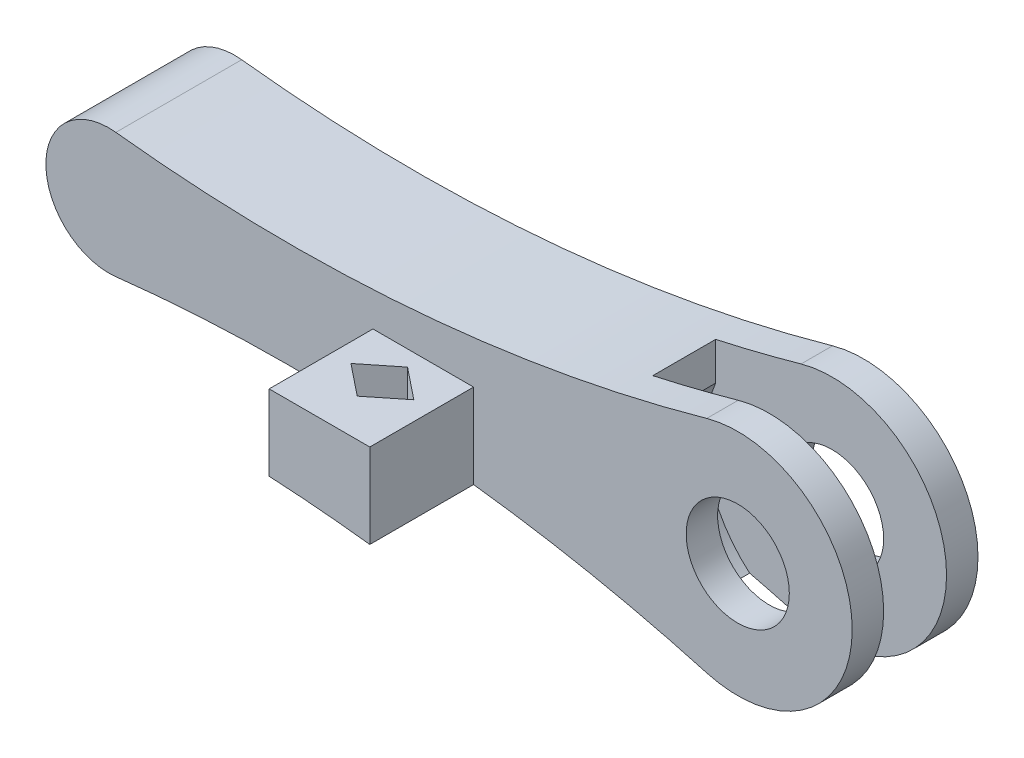
ISO-10303-21;
HEADER;
FILE_DESCRIPTION(('STEP AP214'),'2;1');
FILE_NAME('part.step','',(''),(''),'','','');
FILE_SCHEMA(('AUTOMOTIVE_DESIGN { 1 0 10303 214 1 1 1 1 }'));
ENDSEC;
DATA;
#1=APPLICATION_CONTEXT('core data for automotive mechanical design processes');
#2=APPLICATION_PROTOCOL_DEFINITION('international standard','automotive_design',2000,#1);
#3=PRODUCT_CONTEXT('',#1,'mechanical');
#4=PRODUCT('Part','Part','',(#3));
#5=PRODUCT_RELATED_PRODUCT_CATEGORY('part','',(#4));
#6=PRODUCT_DEFINITION_FORMATION('','',#4);
#7=PRODUCT_DEFINITION_CONTEXT('part definition',#1,'design');
#8=PRODUCT_DEFINITION('design','',#6,#7);
#9=PRODUCT_DEFINITION_SHAPE('','',#8);
#10=(LENGTH_UNIT() NAMED_UNIT(*) SI_UNIT(.MILLI.,.METRE.));
#11=(NAMED_UNIT(*) PLANE_ANGLE_UNIT() SI_UNIT($,.RADIAN.));
#12=(NAMED_UNIT(*) SI_UNIT($,.STERADIAN.) SOLID_ANGLE_UNIT());
#13=UNCERTAINTY_MEASURE_WITH_UNIT(LENGTH_MEASURE(1.E-05),#10,'distance_accuracy_value','');
#14=(GEOMETRIC_REPRESENTATION_CONTEXT(3) GLOBAL_UNCERTAINTY_ASSIGNED_CONTEXT((#13)) GLOBAL_UNIT_ASSIGNED_CONTEXT((#10,
#11,#12)) REPRESENTATION_CONTEXT('',''));
#15=CARTESIAN_POINT('',(0.,0.,0.));
#16=DIRECTION('',(0.,0.,1.));
#17=DIRECTION('',(1.,0.,0.));
#18=AXIS2_PLACEMENT_3D('',#15,#16,#17);
#19=CARTESIAN_POINT('',(0.,0.,5.));
#20=DIRECTION('',(0.,0.,1.));
#21=DIRECTION('',(1.,0.,0.));
#22=AXIS2_PLACEMENT_3D('',#19,#20,#21);
#23=PLANE('',#22);
#24=CARTESIAN_POINT('',(0.,0.,5.));
#25=DIRECTION('',(0.,0.,1.));
#26=DIRECTION('',(1.,0.,0.));
#27=AXIS2_PLACEMENT_3D('',#24,#25,#26);
#28=CIRCLE('',#27,4.1);
#29=CARTESIAN_POINT('',(4.1,0.,5.));
#30=VERTEX_POINT('',#29);
#31=EDGE_CURVE('E272',#30,#30,#28,.T.);
#32=ORIENTED_EDGE('',*,*,#31,.F.);
#33=EDGE_LOOP('',(#32));
#34=FACE_BOUND('',#33,.T.);
#35=CARTESIAN_POINT('',(-35.6231,-126.686837305183,5.));
#36=DIRECTION('',(0.,0.,1.));
#37=DIRECTION('',(1.,0.,0.));
#38=AXIS2_PLACEMENT_3D('',#35,#36,#37);
#39=CIRCLE('',#38,122.5);
#40=CARTESIAN_POINT('',(-49.4362,-4.96811126686994,5.));
#41=VERTEX_POINT('',#40);
#42=CARTESIAN_POINT('',(-29.,-4.36601100651091,5.));
#43=VERTEX_POINT('',#42);
#44=EDGE_CURVE('E270',#41,#43,#39,.F.);
#45=ORIENTED_EDGE('',*,*,#44,.T.);
#46=DIRECTION('',(0.,1.,0.));
#47=VECTOR('',#46,1.);
#48=CARTESIAN_POINT('',(-29.,0.,5.));
#49=LINE('',#48,#47);
#50=CARTESIAN_POINT('',(-29.,1.65114992490566,5.));
#51=VERTEX_POINT('',#50);
#52=EDGE_CURVE('E217',#43,#51,#49,.T.);
#53=ORIENTED_EDGE('',*,*,#52,.T.);
#54=DIRECTION('',(1.,0.,0.));
#55=VECTOR('',#54,1.);
#56=CARTESIAN_POINT('',(0.,1.65114992490567,5.));
#57=LINE('',#56,#55);
#58=CARTESIAN_POINT('',(-21.,1.65114992490562,5.));
#59=VERTEX_POINT('',#58);
#60=EDGE_CURVE('E228',#51,#59,#57,.T.);
#61=ORIENTED_EDGE('',*,*,#60,.T.);
#62=DIRECTION('',(0.,1.,0.));
#63=VECTOR('',#62,1.);
#64=CARTESIAN_POINT('',(-21.,0.,5.));
#65=LINE('',#64,#63);
#66=CARTESIAN_POINT('',(-21.,-5.06276507279181,5.));
#67=VERTEX_POINT('',#66);
#68=EDGE_CURVE('E212',#67,#59,#65,.T.);
#69=ORIENTED_EDGE('',*,*,#68,.F.);
#70=CARTESIAN_POINT('',(-2.46329946808511,-8.76026002642226,5.));
#71=VERTEX_POINT('',#70);
#72=EDGE_CURVE('E269',#67,#71,#39,.F.);
#73=ORIENTED_EDGE('',*,*,#72,.T.);
#74=CARTESIAN_POINT('',(0.,0.,5.));
#75=DIRECTION('',(0.,0.,1.));
#76=DIRECTION('',(1.,0.,0.));
#77=AXIS2_PLACEMENT_3D('',#74,#75,#76);
#78=CIRCLE('',#77,9.1);
#79=CARTESIAN_POINT('',(-2.46329946808511,8.76026002642226,5.));
#80=VERTEX_POINT('',#79);
#81=EDGE_CURVE('E261',#71,#80,#78,.T.);
#82=ORIENTED_EDGE('',*,*,#81,.T.);
#83=CARTESIAN_POINT('',(-35.6231,126.686837305183,5.));
#84=DIRECTION('',(0.,0.,1.));
#85=DIRECTION('',(1.,0.,0.));
#86=AXIS2_PLACEMENT_3D('',#83,#84,#85);
#87=CIRCLE('',#86,122.5);
#88=CARTESIAN_POINT('',(-49.4362,4.96811126686994,5.));
#89=VERTEX_POINT('',#88);
#90=EDGE_CURVE('E263',#89,#80,#87,.T.);
#91=ORIENTED_EDGE('',*,*,#90,.F.);
#92=CARTESIAN_POINT('',(-50.,0.,5.));
#93=DIRECTION('',(0.,0.,1.));
#94=DIRECTION('',(1.,0.,0.));
#95=AXIS2_PLACEMENT_3D('',#92,#93,#94);
#96=CIRCLE('',#95,5.);
#97=EDGE_CURVE('E267',#89,#41,#96,.T.);
#98=ORIENTED_EDGE('',*,*,#97,.T.);
#99=EDGE_LOOP('',(#45,#53,#61,#69,#73,#82,#91,#98));
#100=FACE_BOUND('',#99,.T.);
#101=ADVANCED_FACE('F49',(#34,#100),#23,.T.);
#102=CARTESIAN_POINT('',(0.,0.,5.));
#103=DIRECTION('',(0.,0.,-1.));
#104=DIRECTION('',(-1.,0.,0.));
#105=AXIS2_PLACEMENT_3D('',#102,#103,#104);
#106=CYLINDRICAL_SURFACE('',#105,9.1);
#107=CARTESIAN_POINT('',(0.,0.,-2.5));
#108=DIRECTION('',(0.,0.,1.));
#109=DIRECTION('',(1.,0.,0.));
#110=AXIS2_PLACEMENT_3D('',#107,#108,#109);
#111=CIRCLE('',#110,9.1);
#112=CARTESIAN_POINT('',(-2.46329946808511,-8.76026002642226,-2.5));
#113=VERTEX_POINT('',#112);
#114=CARTESIAN_POINT('',(-2.46329946808511,8.76026002642225,-2.5));
#115=VERTEX_POINT('',#114);
#116=EDGE_CURVE('E257',#113,#115,#111,.T.);
#117=ORIENTED_EDGE('',*,*,#116,.F.);
#118=DIRECTION('',(0.,0.,-1.));
#119=VECTOR('',#118,1.);
#120=CARTESIAN_POINT('',(-2.46329946808511,-8.76026002642226,5.));
#121=LINE('',#120,#119);
#122=CARTESIAN_POINT('',(-2.46329946808511,-8.76026002642226,-5.));
#123=VERTEX_POINT('',#122);
#124=EDGE_CURVE('E275',#113,#123,#121,.T.);
#125=ORIENTED_EDGE('',*,*,#124,.T.);
#126=CARTESIAN_POINT('',(0.,0.,-5.));
#127=DIRECTION('',(0.,0.,1.));
#128=DIRECTION('',(1.,0.,0.));
#129=AXIS2_PLACEMENT_3D('',#126,#127,#128);
#130=CIRCLE('',#129,9.1);
#131=CARTESIAN_POINT('',(-2.46329946808511,8.76026002642226,-5.));
#132=VERTEX_POINT('',#131);
#133=EDGE_CURVE('E260',#123,#132,#130,.T.);
#134=ORIENTED_EDGE('',*,*,#133,.T.);
#135=DIRECTION('',(0.,0.,-1.));
#136=VECTOR('',#135,1.);
#137=CARTESIAN_POINT('',(-2.46329946808511,8.76026002642226,5.));
#138=LINE('',#137,#136);
#139=EDGE_CURVE('E296',#115,#132,#138,.T.);
#140=ORIENTED_EDGE('',*,*,#139,.F.);
#141=EDGE_LOOP('',(#117,#125,#134,#140));
#142=FACE_BOUND('',#141,.T.);
#143=ADVANCED_FACE('F324',(#142),#106,.T.);
#144=CARTESIAN_POINT('',(-35.6231,126.686837305183,5.));
#145=DIRECTION('',(0.,0.,-1.));
#146=DIRECTION('',(-1.,0.,0.));
#147=AXIS2_PLACEMENT_3D('',#144,#145,#146);
#148=CYLINDRICAL_SURFACE('',#147,122.5);
#149=CARTESIAN_POINT('',(-35.6231,126.686837305183,2.5));
#150=DIRECTION('',(0.,0.,1.));
#151=DIRECTION('',(1.,0.,0.));
#152=AXIS2_PLACEMENT_3D('',#149,#150,#151);
#153=CIRCLE('',#152,122.5);
#154=CARTESIAN_POINT('',(-9.25575672154349,7.05819019908241,2.5));
#155=VERTEX_POINT('',#154);
#156=CARTESIAN_POINT('',(-2.46329946808511,8.76026002642225,2.5));
#157=VERTEX_POINT('',#156);
#158=EDGE_CURVE('E65',#155,#157,#153,.T.);
#159=ORIENTED_EDGE('',*,*,#158,.F.);
#160=DIRECTION('',(0.,0.,-1.));
#161=VECTOR('',#160,1.);
#162=CARTESIAN_POINT('',(-9.25575672154349,7.0581901990824,5.));
#163=LINE('',#162,#161);
#164=CARTESIAN_POINT('',(-9.25575672154349,7.05819019908242,-2.5));
#165=VERTEX_POINT('',#164);
#166=EDGE_CURVE('E309',#155,#165,#163,.T.);
#167=ORIENTED_EDGE('',*,*,#166,.T.);
#168=CARTESIAN_POINT('',(-35.6231,126.686837305183,-2.5));
#169=DIRECTION('',(0.,0.,1.));
#170=DIRECTION('',(1.,0.,0.));
#171=AXIS2_PLACEMENT_3D('',#168,#169,#170);
#172=CIRCLE('',#171,122.5);
#173=EDGE_CURVE('E72',#165,#115,#172,.T.);
#174=ORIENTED_EDGE('',*,*,#173,.T.);
#175=ORIENTED_EDGE('',*,*,#139,.T.);
#176=CARTESIAN_POINT('',(-35.6231,126.686837305183,-5.));
#177=DIRECTION('',(0.,0.,1.));
#178=DIRECTION('',(1.,0.,0.));
#179=AXIS2_PLACEMENT_3D('',#176,#177,#178);
#180=CIRCLE('',#179,122.5);
#181=CARTESIAN_POINT('',(-49.4362,4.96811126686994,-5.));
#182=VERTEX_POINT('',#181);
#183=EDGE_CURVE('E278',#182,#132,#180,.T.);
#184=ORIENTED_EDGE('',*,*,#183,.F.);
#185=DIRECTION('',(0.,0.,-1.));
#186=VECTOR('',#185,1.);
#187=CARTESIAN_POINT('',(-49.4362,4.96811126686994,5.));
#188=LINE('',#187,#186);
#189=EDGE_CURVE('E294',#89,#182,#188,.T.);
#190=ORIENTED_EDGE('',*,*,#189,.F.);
#191=ORIENTED_EDGE('',*,*,#90,.T.);
#192=EDGE_CURVE('E297',#80,#157,#138,.T.);
#193=ORIENTED_EDGE('',*,*,#192,.T.);
#194=EDGE_LOOP('',(#159,#167,#174,#175,#184,#190,#191,#193));
#195=FACE_BOUND('',#194,.T.);
#196=ADVANCED_FACE('F319',(#195),#148,.F.);
#197=CARTESIAN_POINT('',(-35.6231,-126.686837305183,5.));
#198=DIRECTION('',(0.,0.,-1.));
#199=DIRECTION('',(-1.,0.,0.));
#200=AXIS2_PLACEMENT_3D('',#197,#198,#199);
#201=CYLINDRICAL_SURFACE('',#200,122.5);
#202=CARTESIAN_POINT('',(-35.6231,-126.686837305183,18.7487672564993));
#203=DIRECTION('',(0.624707922465223,0.,0.780858509340319));
#204=DIRECTION('',(0.780858509340319,0.,-0.624707922465223));
#205=AXIS2_PLACEMENT_3D('',#202,#203,#204);
#206=ELLIPSE('',#205,156.878613135035,122.5);
#207=CARTESIAN_POINT('',(-25.,-4.64831983471422,10.25));
#208=VERTEX_POINT('',#207);
#209=CARTESIAN_POINT('',(-22.5000844994605,-4.8917780286569,8.25));
#210=VERTEX_POINT('',#209);
#211=EDGE_CURVE('E206',#208,#210,#206,.F.);
#212=ORIENTED_EDGE('',*,*,#211,.T.);
#213=CARTESIAN_POINT('',(-35.6231,-126.686837305183,-2.24876725649929));
#214=DIRECTION('',(0.624707922465224,0.,-0.780858509340318));
#215=DIRECTION('',(-0.780858509340318,0.,-0.624707922465224));
#216=AXIS2_PLACEMENT_3D('',#213,#214,#215);
#217=ELLIPSE('',#216,156.878613135035,122.5);
#218=CARTESIAN_POINT('',(-25.,-4.64831983471425,6.25));
#219=VERTEX_POINT('',#218);
#220=EDGE_CURVE('E209',#210,#219,#217,.F.);
#221=ORIENTED_EDGE('',*,*,#220,.T.);
#222=CARTESIAN_POINT('',(-35.6231,-126.686837305183,14.7487672564993));
#223=DIRECTION('',(-0.624707922465224,0.,-0.780858509340318));
#224=DIRECTION('',(0.780858509340318,0.,-0.624707922465224));
#225=AXIS2_PLACEMENT_3D('',#222,#223,#224);
#226=ELLIPSE('',#225,156.878613135035,122.5);
#227=CARTESIAN_POINT('',(-27.4999155005395,-4.45646516475453,8.25));
#228=VERTEX_POINT('',#227);
#229=EDGE_CURVE('E201',#219,#228,#226,.F.);
#230=ORIENTED_EDGE('',*,*,#229,.T.);
#231=CARTESIAN_POINT('',(-35.6231,-126.686837305183,1.75123274350069));
#232=DIRECTION('',(-0.624707922465225,0.,0.780858509340317));
#233=DIRECTION('',(-0.780858509340317,0.,-0.624707922465225));
#234=AXIS2_PLACEMENT_3D('',#231,#232,#233);
#235=ELLIPSE('',#234,156.878613135035,122.5);
#236=EDGE_CURVE('E176',#228,#208,#235,.F.);
#237=ORIENTED_EDGE('',*,*,#236,.T.);
#238=EDGE_LOOP('',(#212,#221,#230,#237));
#239=FACE_BOUND('',#238,.T.);
#240=CARTESIAN_POINT('',(-35.6231,-126.686837305183,-2.5));
#241=DIRECTION('',(0.,0.,1.));
#242=DIRECTION('',(1.,0.,0.));
#243=AXIS2_PLACEMENT_3D('',#240,#241,#242);
#244=CIRCLE('',#243,122.5);
#245=CARTESIAN_POINT('',(-6.55217685229215,-7.68628509075008,-2.5));
#246=VERTEX_POINT('',#245);
#247=EDGE_CURVE('E255',#246,#113,#244,.F.);
#248=ORIENTED_EDGE('',*,*,#247,.F.);
#249=DIRECTION('',(0.,0.,1.));
#250=VECTOR('',#249,1.);
#251=CARTESIAN_POINT('',(-6.55217685229204,-7.68628509075018,0.));
#252=LINE('',#251,#250);
#253=CARTESIAN_POINT('',(-6.55217685229215,-7.68628509075008,2.5));
#254=VERTEX_POINT('',#253);
#255=EDGE_CURVE('E299',#246,#254,#252,.T.);
#256=ORIENTED_EDGE('',*,*,#255,.T.);
#257=CARTESIAN_POINT('',(-35.6231,-126.686837305183,2.5));
#258=DIRECTION('',(0.,0.,1.));
#259=DIRECTION('',(1.,0.,0.));
#260=AXIS2_PLACEMENT_3D('',#257,#258,#259);
#261=CIRCLE('',#260,122.5);
#262=CARTESIAN_POINT('',(-2.46329946808511,-8.76026002642226,2.5));
#263=VERTEX_POINT('',#262);
#264=EDGE_CURVE('E247',#254,#263,#261,.F.);
#265=ORIENTED_EDGE('',*,*,#264,.T.);
#266=EDGE_CURVE('E288',#71,#263,#121,.T.);
#267=ORIENTED_EDGE('',*,*,#266,.F.);
#268=ORIENTED_EDGE('',*,*,#72,.F.);
#269=DIRECTION('',(0.,0.,-1.));
#270=VECTOR('',#269,1.);
#271=CARTESIAN_POINT('',(-21.,-5.06276507279181,13.25));
#272=LINE('',#271,#270);
#273=CARTESIAN_POINT('',(-21.,-5.06276507279181,13.25));
#274=VERTEX_POINT('',#273);
#275=EDGE_CURVE('E239',#274,#67,#272,.T.);
#276=ORIENTED_EDGE('',*,*,#275,.F.);
#277=CARTESIAN_POINT('',(-35.6231,-126.686837305183,13.25));
#278=DIRECTION('',(0.,0.,1.));
#279=DIRECTION('',(1.,0.,0.));
#280=AXIS2_PLACEMENT_3D('',#277,#278,#279);
#281=CIRCLE('',#280,122.5);
#282=CARTESIAN_POINT('',(-29.,-4.3660110065109,13.25));
#283=VERTEX_POINT('',#282);
#284=EDGE_CURVE('E213',#283,#274,#281,.F.);
#285=ORIENTED_EDGE('',*,*,#284,.F.);
#286=DIRECTION('',(0.,0.,-1.));
#287=VECTOR('',#286,1.);
#288=CARTESIAN_POINT('',(-29.,-4.3660110065109,13.25));
#289=LINE('',#288,#287);
#290=EDGE_CURVE('E225',#283,#43,#289,.T.);
#291=ORIENTED_EDGE('',*,*,#290,.T.);
#292=ORIENTED_EDGE('',*,*,#44,.F.);
#293=DIRECTION('',(0.,0.,-1.));
#294=VECTOR('',#293,1.);
#295=CARTESIAN_POINT('',(-49.4362,-4.96811126686994,5.));
#296=LINE('',#295,#294);
#297=CARTESIAN_POINT('',(-49.4362,-4.96811126686994,-5.));
#298=VERTEX_POINT('',#297);
#299=EDGE_CURVE('E291',#41,#298,#296,.T.);
#300=ORIENTED_EDGE('',*,*,#299,.T.);
#301=CARTESIAN_POINT('',(-35.6231,-126.686837305183,-5.));
#302=DIRECTION('',(0.,0.,1.));
#303=DIRECTION('',(1.,0.,0.));
#304=AXIS2_PLACEMENT_3D('',#301,#302,#303);
#305=CIRCLE('',#304,122.5);
#306=EDGE_CURVE('E283',#298,#123,#305,.F.);
#307=ORIENTED_EDGE('',*,*,#306,.T.);
#308=ORIENTED_EDGE('',*,*,#124,.F.);
#309=EDGE_LOOP('',(#248,#256,#265,#267,#268,#276,#285,#291,#292,#300,#307,#308));
#310=FACE_BOUND('',#309,.T.);
#311=ADVANCED_FACE('F347',(#239,#310),#201,.F.);
#312=CARTESIAN_POINT('',(0.,0.,5.));
#313=DIRECTION('',(0.,0.,-1.));
#314=DIRECTION('',(-1.,0.,0.));
#315=AXIS2_PLACEMENT_3D('',#312,#313,#314);
#316=CYLINDRICAL_SURFACE('',#315,4.1);
#317=CARTESIAN_POINT('',(0.,0.,-5.));
#318=DIRECTION('',(0.,0.,1.));
#319=DIRECTION('',(1.,0.,0.));
#320=AXIS2_PLACEMENT_3D('',#317,#318,#319);
#321=CIRCLE('',#320,4.1);
#322=CARTESIAN_POINT('',(4.1,0.,-5.));
#323=VERTEX_POINT('',#322);
#324=EDGE_CURVE('E264',#323,#323,#321,.T.);
#325=ORIENTED_EDGE('',*,*,#324,.F.);
#326=EDGE_LOOP('',(#325));
#327=FACE_BOUND('',#326,.T.);
#328=CARTESIAN_POINT('',(0.,0.,-2.5));
#329=DIRECTION('',(0.,0.,1.));
#330=DIRECTION('',(1.,0.,0.));
#331=AXIS2_PLACEMENT_3D('',#328,#329,#330);
#332=CIRCLE('',#331,4.1);
#333=CARTESIAN_POINT('',(4.1,0.,-2.5));
#334=VERTEX_POINT('',#333);
#335=EDGE_CURVE('E254',#334,#334,#332,.T.);
#336=ORIENTED_EDGE('',*,*,#335,.T.);
#337=EDGE_LOOP('',(#336));
#338=FACE_BOUND('',#337,.T.);
#339=ADVANCED_FACE('F380',(#327,#338),#316,.F.);
#340=ORIENTED_EDGE('',*,*,#266,.T.);
#341=CARTESIAN_POINT('',(0.,0.,2.5));
#342=DIRECTION('',(0.,0.,1.));
#343=DIRECTION('',(1.,0.,0.));
#344=AXIS2_PLACEMENT_3D('',#341,#342,#343);
#345=CIRCLE('',#344,9.1);
#346=EDGE_CURVE('E250',#263,#157,#345,.T.);
#347=ORIENTED_EDGE('',*,*,#346,.T.);
#348=ORIENTED_EDGE('',*,*,#192,.F.);
#349=ORIENTED_EDGE('',*,*,#81,.F.);
#350=EDGE_LOOP('',(#340,#347,#348,#349));
#351=FACE_BOUND('',#350,.T.);
#352=ADVANCED_FACE('F344',(#351),#106,.T.);
#353=CARTESIAN_POINT('',(-50.,0.,5.));
#354=DIRECTION('',(0.,0.,-1.));
#355=DIRECTION('',(-1.,0.,0.));
#356=AXIS2_PLACEMENT_3D('',#353,#354,#355);
#357=CYLINDRICAL_SURFACE('',#356,5.);
#358=CARTESIAN_POINT('',(-50.,0.,-5.));
#359=DIRECTION('',(0.,0.,1.));
#360=DIRECTION('',(1.,0.,0.));
#361=AXIS2_PLACEMENT_3D('',#358,#359,#360);
#362=CIRCLE('',#361,5.);
#363=EDGE_CURVE('E281',#182,#298,#362,.T.);
#364=ORIENTED_EDGE('',*,*,#363,.T.);
#365=ORIENTED_EDGE('',*,*,#299,.F.);
#366=ORIENTED_EDGE('',*,*,#97,.F.);
#367=ORIENTED_EDGE('',*,*,#189,.T.);
#368=EDGE_LOOP('',(#364,#365,#366,#367));
#369=FACE_BOUND('',#368,.T.);
#370=ADVANCED_FACE('F336',(#369),#357,.T.);
#371=CARTESIAN_POINT('',(0.,0.,2.5));
#372=DIRECTION('',(0.,0.,1.));
#373=DIRECTION('',(1.,0.,0.));
#374=AXIS2_PLACEMENT_3D('',#371,#372,#373);
#375=CIRCLE('',#374,4.1);
#376=CARTESIAN_POINT('',(4.1,0.,2.5));
#377=VERTEX_POINT('',#376);
#378=EDGE_CURVE('E245',#377,#377,#375,.T.);
#379=ORIENTED_EDGE('',*,*,#378,.F.);
#380=EDGE_LOOP('',(#379));
#381=FACE_BOUND('',#380,.T.);
#382=ORIENTED_EDGE('',*,*,#31,.T.);
#383=EDGE_LOOP('',(#382));
#384=FACE_BOUND('',#383,.T.);
#385=ADVANCED_FACE('F377',(#381,#384),#316,.F.);
#386=CARTESIAN_POINT('',(0.,0.,-5.));
#387=DIRECTION('',(0.,0.,1.));
#388=DIRECTION('',(1.,0.,0.));
#389=AXIS2_PLACEMENT_3D('',#386,#387,#388);
#390=PLANE('',#389);
#391=ORIENTED_EDGE('',*,*,#133,.F.);
#392=ORIENTED_EDGE('',*,*,#306,.F.);
#393=ORIENTED_EDGE('',*,*,#363,.F.);
#394=ORIENTED_EDGE('',*,*,#183,.T.);
#395=EDGE_LOOP('',(#391,#392,#393,#394));
#396=FACE_BOUND('',#395,.T.);
#397=ORIENTED_EDGE('',*,*,#324,.T.);
#398=EDGE_LOOP('',(#397));
#399=FACE_BOUND('',#398,.T.);
#400=ADVANCED_FACE('F330',(#396,#399),#390,.F.);
#401=CARTESIAN_POINT('',(0.,0.,-2.5));
#402=DIRECTION('',(0.,0.,1.));
#403=DIRECTION('',(1.,0.,0.));
#404=AXIS2_PLACEMENT_3D('',#401,#402,#403);
#405=CYLINDRICAL_SURFACE('',#404,10.1);
#406=CARTESIAN_POINT('',(0.,0.,-2.5));
#407=DIRECTION('',(0.,0.,1.));
#408=DIRECTION('',(1.,0.,0.));
#409=AXIS2_PLACEMENT_3D('',#406,#407,#408);
#410=CIRCLE('',#409,10.1);
#411=CARTESIAN_POINT('',(-9.25381197382283,4.04684617364353,-2.5));
#412=VERTEX_POINT('',#411);
#413=EDGE_CURVE('E243',#412,#246,#410,.T.);
#414=ORIENTED_EDGE('',*,*,#413,.F.);
#415=DIRECTION('',(0.,0.,1.));
#416=VECTOR('',#415,1.);
#417=CARTESIAN_POINT('',(-9.25381197382283,4.04684617364353,-2.5));
#418=LINE('',#417,#416);
#419=CARTESIAN_POINT('',(-9.25381197382283,4.04684617364353,2.5));
#420=VERTEX_POINT('',#419);
#421=EDGE_CURVE('E306',#412,#420,#418,.T.);
#422=ORIENTED_EDGE('',*,*,#421,.T.);
#423=CARTESIAN_POINT('',(0.,0.,2.5));
#424=DIRECTION('',(0.,0.,1.));
#425=DIRECTION('',(1.,0.,0.));
#426=AXIS2_PLACEMENT_3D('',#423,#424,#425);
#427=CIRCLE('',#426,10.1);
#428=EDGE_CURVE('E242',#420,#254,#427,.T.);
#429=ORIENTED_EDGE('',*,*,#428,.T.);
#430=ORIENTED_EDGE('',*,*,#255,.F.);
#431=EDGE_LOOP('',(#414,#422,#429,#430));
#432=FACE_BOUND('',#431,.T.);
#433=ADVANCED_FACE('F351',(#432),#405,.F.);
#434=CARTESIAN_POINT('',(0.,0.,-2.5));
#435=DIRECTION('',(0.,0.,1.));
#436=DIRECTION('',(1.,0.,0.));
#437=AXIS2_PLACEMENT_3D('',#434,#435,#436);
#438=PLANE('',#437);
#439=ORIENTED_EDGE('',*,*,#335,.F.);
#440=EDGE_LOOP('',(#439));
#441=FACE_BOUND('',#440,.T.);
#442=ORIENTED_EDGE('',*,*,#173,.F.);
#443=DIRECTION('',(-0.000645807087695693,0.999999791466581,0.));
#444=VECTOR('',#443,1.);
#445=CARTESIAN_POINT('',(-9.25381197382283,4.04684617364353,-2.5));
#446=LINE('',#445,#444);
#447=EDGE_CURVE('E11',#165,#412,#446,.F.);
#448=ORIENTED_EDGE('',*,*,#447,.T.);
#449=ORIENTED_EDGE('',*,*,#413,.T.);
#450=ORIENTED_EDGE('',*,*,#247,.T.);
#451=ORIENTED_EDGE('',*,*,#116,.T.);
#452=EDGE_LOOP('',(#442,#448,#449,#450,#451));
#453=FACE_BOUND('',#452,.T.);
#454=ADVANCED_FACE('F352',(#441,#453),#438,.T.);
#455=CARTESIAN_POINT('',(0.,0.,2.5));
#456=DIRECTION('',(0.,0.,1.));
#457=DIRECTION('',(1.,0.,0.));
#458=AXIS2_PLACEMENT_3D('',#455,#456,#457);
#459=PLANE('',#458);
#460=ORIENTED_EDGE('',*,*,#158,.T.);
#461=ORIENTED_EDGE('',*,*,#346,.F.);
#462=ORIENTED_EDGE('',*,*,#264,.F.);
#463=ORIENTED_EDGE('',*,*,#428,.F.);
#464=DIRECTION('',(0.000645807087695693,-0.999999791466581,0.));
#465=VECTOR('',#464,1.);
#466=CARTESIAN_POINT('',(-9.25119463296838,-0.00597448830950381,2.5));
#467=LINE('',#466,#465);
#468=EDGE_CURVE('E58',#420,#155,#467,.F.);
#469=ORIENTED_EDGE('',*,*,#468,.T.);
#470=EDGE_LOOP('',(#460,#461,#462,#463,#469));
#471=FACE_BOUND('',#470,.T.);
#472=ORIENTED_EDGE('',*,*,#378,.T.);
#473=EDGE_LOOP('',(#472));
#474=FACE_BOUND('',#473,.T.);
#475=ADVANCED_FACE('F313',(#471,#474),#459,.F.);
#476=CARTESIAN_POINT('',(-21.,0.,13.25));
#477=DIRECTION('',(-1.,0.,0.));
#478=DIRECTION('',(0.,0.,1.));
#479=AXIS2_PLACEMENT_3D('',#476,#477,#478);
#480=PLANE('',#479);
#481=ORIENTED_EDGE('',*,*,#68,.T.);
#482=DIRECTION('',(0.,0.,-1.));
#483=VECTOR('',#482,1.);
#484=CARTESIAN_POINT('',(-21.,1.65114992490562,13.25));
#485=LINE('',#484,#483);
#486=CARTESIAN_POINT('',(-21.,1.65114992490562,13.25));
#487=VERTEX_POINT('',#486);
#488=EDGE_CURVE('E236',#487,#59,#485,.T.);
#489=ORIENTED_EDGE('',*,*,#488,.F.);
#490=DIRECTION('',(0.,1.,0.));
#491=VECTOR('',#490,1.);
#492=CARTESIAN_POINT('',(-21.,0.,13.25));
#493=LINE('',#492,#491);
#494=EDGE_CURVE('E216',#274,#487,#493,.T.);
#495=ORIENTED_EDGE('',*,*,#494,.F.);
#496=ORIENTED_EDGE('',*,*,#275,.T.);
#497=EDGE_LOOP('',(#481,#489,#495,#496));
#498=FACE_BOUND('',#497,.T.);
#499=ADVANCED_FACE('F360',(#498),#480,.F.);
#500=CARTESIAN_POINT('',(0.,1.65114992490567,13.25));
#501=DIRECTION('',(0.,1.,0.));
#502=DIRECTION('',(-1.,0.,0.));
#503=AXIS2_PLACEMENT_3D('',#500,#501,#502);
#504=PLANE('',#503);
#505=DIRECTION('',(-0.780858509340318,0.,-0.624707922465224));
#506=VECTOR('',#505,1.);
#507=CARTESIAN_POINT('',(-22.5000844994605,1.65114992490567,8.25));
#508=LINE('',#507,#506);
#509=CARTESIAN_POINT('',(-22.5000844994605,1.65114992490567,8.25));
#510=VERTEX_POINT('',#509);
#511=CARTESIAN_POINT('',(-25.,1.65114992490567,6.25));
#512=VERTEX_POINT('',#511);
#513=EDGE_CURVE('E189',#510,#512,#508,.T.);
#514=ORIENTED_EDGE('',*,*,#513,.F.);
#515=DIRECTION('',(0.780858509340319,0.,-0.624707922465223));
#516=VECTOR('',#515,1.);
#517=CARTESIAN_POINT('',(-22.5000844994605,1.65114992490567,8.25));
#518=LINE('',#517,#516);
#519=CARTESIAN_POINT('',(-25.,1.65114992490567,10.25));
#520=VERTEX_POINT('',#519);
#521=EDGE_CURVE('E194',#520,#510,#518,.T.);
#522=ORIENTED_EDGE('',*,*,#521,.F.);
#523=DIRECTION('',(0.780858509340317,0.,0.624707922465225));
#524=VECTOR('',#523,1.);
#525=CARTESIAN_POINT('',(-25.,1.65114992490567,10.25));
#526=LINE('',#525,#524);
#527=CARTESIAN_POINT('',(-27.4999155005395,1.65114992490567,8.25));
#528=VERTEX_POINT('',#527);
#529=EDGE_CURVE('E173',#528,#520,#526,.T.);
#530=ORIENTED_EDGE('',*,*,#529,.F.);
#531=DIRECTION('',(-0.780858509340318,0.,0.624707922465224));
#532=VECTOR('',#531,1.);
#533=CARTESIAN_POINT('',(-25.,1.65114992490567,6.25));
#534=LINE('',#533,#532);
#535=EDGE_CURVE('E184',#512,#528,#534,.T.);
#536=ORIENTED_EDGE('',*,*,#535,.F.);
#537=EDGE_LOOP('',(#514,#522,#530,#536));
#538=FACE_BOUND('',#537,.T.);
#539=ORIENTED_EDGE('',*,*,#60,.F.);
#540=DIRECTION('',(0.,0.,-1.));
#541=VECTOR('',#540,1.);
#542=CARTESIAN_POINT('',(-29.,1.65114992490566,13.25));
#543=LINE('',#542,#541);
#544=CARTESIAN_POINT('',(-29.,1.65114992490566,13.25));
#545=VERTEX_POINT('',#544);
#546=EDGE_CURVE('E233',#545,#51,#543,.T.);
#547=ORIENTED_EDGE('',*,*,#546,.F.);
#548=DIRECTION('',(1.,0.,0.));
#549=VECTOR('',#548,1.);
#550=CARTESIAN_POINT('',(0.,1.65114992490567,13.25));
#551=LINE('',#550,#549);
#552=EDGE_CURVE('E219',#545,#487,#551,.T.);
#553=ORIENTED_EDGE('',*,*,#552,.T.);
#554=ORIENTED_EDGE('',*,*,#488,.T.);
#555=EDGE_LOOP('',(#539,#547,#553,#554));
#556=FACE_BOUND('',#555,.T.);
#557=ADVANCED_FACE('F191',(#538,#556),#504,.T.);
#558=CARTESIAN_POINT('',(-29.,0.,13.25));
#559=DIRECTION('',(-1.,0.,0.));
#560=DIRECTION('',(0.,0.,1.));
#561=AXIS2_PLACEMENT_3D('',#558,#559,#560);
#562=PLANE('',#561);
#563=ORIENTED_EDGE('',*,*,#52,.F.);
#564=ORIENTED_EDGE('',*,*,#290,.F.);
#565=DIRECTION('',(0.,1.,0.));
#566=VECTOR('',#565,1.);
#567=CARTESIAN_POINT('',(-29.,0.,13.25));
#568=LINE('',#567,#566);
#569=EDGE_CURVE('E222',#283,#545,#568,.T.);
#570=ORIENTED_EDGE('',*,*,#569,.T.);
#571=ORIENTED_EDGE('',*,*,#546,.T.);
#572=EDGE_LOOP('',(#563,#564,#570,#571));
#573=FACE_BOUND('',#572,.T.);
#574=ADVANCED_FACE('F479',(#573),#562,.T.);
#575=CARTESIAN_POINT('',(0.,0.,13.25));
#576=DIRECTION('',(0.,0.,1.));
#577=DIRECTION('',(1.,0.,0.));
#578=AXIS2_PLACEMENT_3D('',#575,#576,#577);
#579=PLANE('',#578);
#580=ORIENTED_EDGE('',*,*,#284,.T.);
#581=ORIENTED_EDGE('',*,*,#494,.T.);
#582=ORIENTED_EDGE('',*,*,#552,.F.);
#583=ORIENTED_EDGE('',*,*,#569,.F.);
#584=EDGE_LOOP('',(#580,#581,#582,#583));
#585=FACE_BOUND('',#584,.T.);
#586=ADVANCED_FACE('F487',(#585),#579,.T.);
#587=CARTESIAN_POINT('',(-22.5000844994605,-9.1,8.25));
#588=DIRECTION('',(0.624707922465224,0.,-0.780858509340318));
#589=DIRECTION('',(-0.780858509340318,0.,-0.624707922465224));
#590=AXIS2_PLACEMENT_3D('',#587,#588,#589);
#591=PLANE('',#590);
#592=DIRECTION('',(0.,1.,0.));
#593=VECTOR('',#592,1.);
#594=CARTESIAN_POINT('',(-22.5000844994605,-9.1,8.25));
#595=LINE('',#594,#593);
#596=EDGE_CURVE('E199',#210,#510,#595,.T.);
#597=ORIENTED_EDGE('',*,*,#596,.T.);
#598=ORIENTED_EDGE('',*,*,#513,.T.);
#599=DIRECTION('',(0.,1.,0.));
#600=VECTOR('',#599,1.);
#601=CARTESIAN_POINT('',(-25.,-9.1,6.25));
#602=LINE('',#601,#600);
#603=EDGE_CURVE('E180',#219,#512,#602,.T.);
#604=ORIENTED_EDGE('',*,*,#603,.F.);
#605=ORIENTED_EDGE('',*,*,#220,.F.);
#606=EDGE_LOOP('',(#597,#598,#604,#605));
#607=FACE_BOUND('',#606,.T.);
#608=ADVANCED_FACE('F496',(#607),#591,.F.);
#609=CARTESIAN_POINT('',(-22.5000844994605,-9.1,8.25));
#610=DIRECTION('',(0.624707922465223,0.,0.780858509340319));
#611=DIRECTION('',(0.780858509340319,0.,-0.624707922465223));
#612=AXIS2_PLACEMENT_3D('',#609,#610,#611);
#613=PLANE('',#612);
#614=DIRECTION('',(0.,1.,0.));
#615=VECTOR('',#614,1.);
#616=CARTESIAN_POINT('',(-25.,-9.1,10.25));
#617=LINE('',#616,#615);
#618=EDGE_CURVE('E179',#208,#520,#617,.T.);
#619=ORIENTED_EDGE('',*,*,#618,.T.);
#620=ORIENTED_EDGE('',*,*,#521,.T.);
#621=ORIENTED_EDGE('',*,*,#596,.F.);
#622=ORIENTED_EDGE('',*,*,#211,.F.);
#623=EDGE_LOOP('',(#619,#620,#621,#622));
#624=FACE_BOUND('',#623,.T.);
#625=ADVANCED_FACE('F505',(#624),#613,.F.);
#626=CARTESIAN_POINT('',(-25.,-9.1,10.25));
#627=DIRECTION('',(-0.624707922465225,0.,0.780858509340317));
#628=DIRECTION('',(0.780858509340317,0.,0.624707922465225));
#629=AXIS2_PLACEMENT_3D('',#626,#627,#628);
#630=PLANE('',#629);
#631=DIRECTION('',(0.,1.,0.));
#632=VECTOR('',#631,1.);
#633=CARTESIAN_POINT('',(-27.4999155005395,-9.1,8.25));
#634=LINE('',#633,#632);
#635=EDGE_CURVE('E168',#228,#528,#634,.T.);
#636=ORIENTED_EDGE('',*,*,#635,.T.);
#637=ORIENTED_EDGE('',*,*,#529,.T.);
#638=ORIENTED_EDGE('',*,*,#618,.F.);
#639=ORIENTED_EDGE('',*,*,#236,.F.);
#640=EDGE_LOOP('',(#636,#637,#638,#639));
#641=FACE_BOUND('',#640,.T.);
#642=ADVANCED_FACE('F170',(#641),#630,.F.);
#643=CARTESIAN_POINT('',(-25.,-9.1,6.25));
#644=DIRECTION('',(-0.624707922465224,0.,-0.780858509340318));
#645=DIRECTION('',(-0.780858509340318,0.,0.624707922465224));
#646=AXIS2_PLACEMENT_3D('',#643,#644,#645);
#647=PLANE('',#646);
#648=ORIENTED_EDGE('',*,*,#603,.T.);
#649=ORIENTED_EDGE('',*,*,#535,.T.);
#650=ORIENTED_EDGE('',*,*,#635,.F.);
#651=ORIENTED_EDGE('',*,*,#229,.F.);
#652=EDGE_LOOP('',(#648,#649,#650,#651));
#653=FACE_BOUND('',#652,.T.);
#654=ADVANCED_FACE('F185',(#653),#647,.F.);
#655=CARTESIAN_POINT('',(-9.25381197382283,4.04684617364353,5.));
#656=DIRECTION('',(-0.999999791466581,-0.000645807087695693,0.));
#657=DIRECTION('',(0.,0.,1.));
#658=AXIS2_PLACEMENT_3D('',#655,#656,#657);
#659=PLANE('',#658);
#660=ORIENTED_EDGE('',*,*,#447,.F.);
#661=ORIENTED_EDGE('',*,*,#166,.F.);
#662=ORIENTED_EDGE('',*,*,#468,.F.);
#663=ORIENTED_EDGE('',*,*,#421,.F.);
#664=EDGE_LOOP('',(#660,#661,#662,#663));
#665=FACE_BOUND('',#664,.T.);
#666=ADVANCED_FACE('F52',(#665),#659,.F.);
#667=CLOSED_SHELL('',(#101,#143,#196,#311,#339,#352,#370,#385,#400,#433,#454,#475,#499,#557,
#574,#586,#608,#625,#642,#654,#666));
#668=MANIFOLD_SOLID_BREP('B2',#667);
#669=ADVANCED_BREP_SHAPE_REPRESENTATION('',(#18,#668),#14);
#670=SHAPE_DEFINITION_REPRESENTATION(#9,#669);
ENDSEC;
END-ISO-10303-21;
